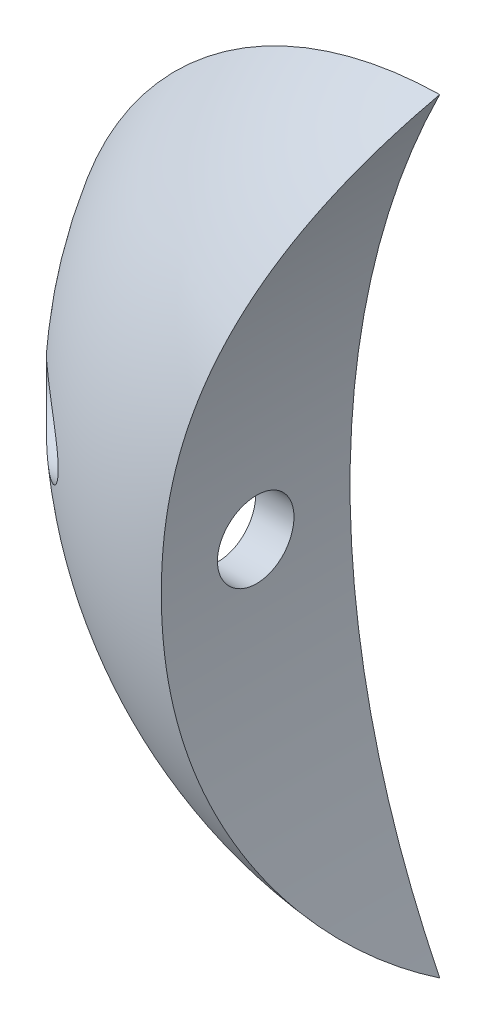
ISO-10303-21;
HEADER;
FILE_DESCRIPTION(('STEP AP214'),'2;1');
FILE_NAME('part.step','',(''),(''),'','','');
FILE_SCHEMA(('AUTOMOTIVE_DESIGN { 1 0 10303 214 1 1 1 1 }'));
ENDSEC;
DATA;
#1=APPLICATION_CONTEXT('core data for automotive mechanical design processes');
#2=APPLICATION_PROTOCOL_DEFINITION('international standard','automotive_design',2000,#1);
#3=PRODUCT_CONTEXT('',#1,'mechanical');
#4=PRODUCT('Part','Part','',(#3));
#5=PRODUCT_RELATED_PRODUCT_CATEGORY('part','',(#4));
#6=PRODUCT_DEFINITION_FORMATION('','',#4);
#7=PRODUCT_DEFINITION_CONTEXT('part definition',#1,'design');
#8=PRODUCT_DEFINITION('design','',#6,#7);
#9=PRODUCT_DEFINITION_SHAPE('','',#8);
#10=(LENGTH_UNIT() NAMED_UNIT(*) SI_UNIT(.MILLI.,.METRE.));
#11=(NAMED_UNIT(*) PLANE_ANGLE_UNIT() SI_UNIT($,.RADIAN.));
#12=(NAMED_UNIT(*) SI_UNIT($,.STERADIAN.) SOLID_ANGLE_UNIT());
#13=UNCERTAINTY_MEASURE_WITH_UNIT(LENGTH_MEASURE(1.E-05),#10,'distance_accuracy_value','');
#14=(GEOMETRIC_REPRESENTATION_CONTEXT(3) GLOBAL_UNCERTAINTY_ASSIGNED_CONTEXT((#13)) GLOBAL_UNIT_ASSIGNED_CONTEXT((#10,
#11,#12)) REPRESENTATION_CONTEXT('',''));
#15=CARTESIAN_POINT('',(0.,0.,0.));
#16=DIRECTION('',(0.,0.,1.));
#17=DIRECTION('',(1.,0.,0.));
#18=AXIS2_PLACEMENT_3D('',#15,#16,#17);
#19=CARTESIAN_POINT('',(20.,-2.8421709430404E-13,5.));
#20=DIRECTION('',(0.,0.,-1.));
#21=DIRECTION('',(-1.,0.,0.));
#22=AXIS2_PLACEMENT_3D('',#19,#20,#21);
#23=CYLINDRICAL_SURFACE('',#22,22.5);
#24=CARTESIAN_POINT('',(-2.5,0.,1.46623123312529));
#25=CARTESIAN_POINT('',(-2.49999970200126,-0.0561407001500908,1.46623371342012));
#26=CARTESIAN_POINT('',(-2.49978762986184,-0.112321401379746,1.47097477575549));
#27=CARTESIAN_POINT('',(-2.4989620196337,-0.223133518833943,1.489820880681));
#28=CARTESIAN_POINT('',(-2.49834800639444,-0.277763021477216,1.50393700619354));
#29=CARTESIAN_POINT('',(-2.496788022875,-0.383851449231198,1.54112876239483));
#30=CARTESIAN_POINT('',(-2.4958422195722,-0.435311953893261,1.56419988699213));
#31=CARTESIAN_POINT('',(-2.49372523005697,-0.533615645913031,1.61863996101896));
#32=CARTESIAN_POINT('',(-2.49255409766115,-0.580459931756681,1.65000692977394));
#33=CARTESIAN_POINT('',(-2.49011715050535,-0.668254361190132,1.72017751513281));
#34=CARTESIAN_POINT('',(-2.48885126813371,-0.709200233670585,1.75898647363515));
#35=CARTESIAN_POINT('',(-2.48636807973794,-0.783999222195647,1.84292896788812));
#36=CARTESIAN_POINT('',(-2.48515077568323,-0.817852050916981,1.88806275972));
#37=CARTESIAN_POINT('',(-2.48290156216832,-0.877514854244571,1.98339496698191));
#38=CARTESIAN_POINT('',(-2.48186972644339,-0.903321633024065,2.03359538438248));
#39=CARTESIAN_POINT('',(-2.48010859429159,-0.946139231500847,2.13762171367778));
#40=CARTESIAN_POINT('',(-2.47937929592463,-0.963150107603685,2.19144760232091));
#41=CARTESIAN_POINT('',(-2.47830606766049,-0.987882118361988,2.30115891631267));
#42=CARTESIAN_POINT('',(-2.47796188106446,-0.995609441286061,2.3570429441006));
#43=CARTESIAN_POINT('',(-2.47769691710144,-1.00157408259749,2.46931593159571));
#44=CARTESIAN_POINT('',(-2.47777613693493,-0.999811463731322,2.52570488796189));
#45=CARTESIAN_POINT('',(-2.47834881364447,-0.986851423933263,2.6373450287686));
#46=CARTESIAN_POINT('',(-2.47884197705066,-0.97566068714837,2.69259699086967));
#47=CARTESIAN_POINT('',(-2.48018649120723,-0.944172429252886,2.80043733087246));
#48=CARTESIAN_POINT('',(-2.48103784323402,-0.923874875689811,2.85302569928162));
#49=CARTESIAN_POINT('',(-2.48300311283927,-0.874741508778995,2.95406760448545));
#50=CARTESIAN_POINT('',(-2.48411712427134,-0.845902642498839,3.00251965483986));
#51=CARTESIAN_POINT('',(-2.48648204909733,-0.780507512187128,3.0938972816263));
#52=CARTESIAN_POINT('',(-2.48773296324329,-0.743951205760373,3.1368228276968));
#53=CARTESIAN_POINT('',(-2.49023200011688,-0.664121146537158,3.21596785872733));
#54=CARTESIAN_POINT('',(-2.49148011948889,-0.62084160371057,3.25218150390637));
#55=CARTESIAN_POINT('',(-2.49383183917196,-0.528813989725175,3.31682977508459));
#56=CARTESIAN_POINT('',(-2.49493543945202,-0.480065917393266,3.34526439941503));
#57=CARTESIAN_POINT('',(-2.49687377132322,-0.378481659078785,3.39354688667477));
#58=CARTESIAN_POINT('',(-2.49770849673829,-0.325645379224527,3.41339455236495));
#59=CARTESIAN_POINT('',(-2.49901490497213,-0.217386029032361,3.44393593264616));
#60=CARTESIAN_POINT('',(-2.49948658994129,-0.161962974018597,3.45462970145792));
#61=CARTESIAN_POINT('',(-2.50001347811559,-0.0501540421328536,3.46655254740309));
#62=CARTESIAN_POINT('',(-2.50006903680915,0.00623097166894591,3.46778970315174));
#63=CARTESIAN_POINT('',(-2.49975835363785,0.118407826438631,3.4607852774643));
#64=CARTESIAN_POINT('',(-2.49939211287036,0.174199668949357,3.45254372068845));
#65=CARTESIAN_POINT('',(-2.49827931845409,0.283583858106866,3.42682250354114));
#66=CARTESIAN_POINT('',(-2.4975329163893,0.337177072229535,3.40934652516203));
#67=CARTESIAN_POINT('',(-2.49574385788527,0.440669387084188,3.36565627598857));
#68=CARTESIAN_POINT('',(-2.49470120010262,0.49056847106335,3.33944196556901));
#69=CARTESIAN_POINT('',(-2.49243609122903,0.585293200614388,3.27899845571721));
#70=CARTESIAN_POINT('',(-2.49121351870383,0.630115383062398,3.24476383362774));
#71=CARTESIAN_POINT('',(-2.48872670358069,0.713379165435896,3.16925943061788));
#72=CARTESIAN_POINT('',(-2.48746246076841,0.751820732534277,3.12798961350491));
#73=CARTESIAN_POINT('',(-2.48503379564252,0.821259199602127,3.039551606757));
#74=CARTESIAN_POINT('',(-2.48386944371127,0.852250877696047,2.99237931489225));
#75=CARTESIAN_POINT('',(-2.4817729560006,0.90587414200463,2.89349618625071));
#76=CARTESIAN_POINT('',(-2.4808408193695,0.928505758880875,2.84178536612041));
#77=CARTESIAN_POINT('',(-2.47931437174509,0.964757347288472,2.73531250969526));
#78=CARTESIAN_POINT('',(-2.47871993536801,0.978380663794425,2.6805516141573));
#79=CARTESIAN_POINT('',(-2.47793556416301,0.996239882420215,2.56951705239061));
#80=CARTESIAN_POINT('',(-2.4777456276766,1.00047582302932,2.51324339236532));
#81=CARTESIAN_POINT('',(-2.47779171818862,0.999439661359756,2.40083273056477));
#82=CARTESIAN_POINT('',(-2.47802737699578,0.994175777577939,2.34469565269704));
#83=CARTESIAN_POINT('',(-2.47889731869429,0.974306356015566,2.23410300465704));
#84=CARTESIAN_POINT('',(-2.47953160235679,0.959700800163337,2.17964743773791));
#85=CARTESIAN_POINT('',(-2.48112722235125,0.921564212572995,2.07396161881699));
#86=CARTESIAN_POINT('',(-2.48208856236191,0.898033080440564,2.0227314031013));
#87=CARTESIAN_POINT('',(-2.48422990329677,0.842714934197416,1.92494867625429));
#88=CARTESIAN_POINT('',(-2.48540989711962,0.810928188195256,1.87839601328327));
#89=CARTESIAN_POINT('',(-2.4878566863846,0.739972454791415,1.79124928582556));
#90=CARTESIAN_POINT('',(-2.48912354684377,0.700797898592305,1.75065975757007));
#91=CARTESIAN_POINT('',(-2.4916008946134,0.616179215813134,1.67662123122479));
#92=CARTESIAN_POINT('',(-2.4928113679493,0.570733545988788,1.64317399594308));
#93=CARTESIAN_POINT('',(-2.49504022309919,0.474832913352243,1.58435715679727));
#94=CARTESIAN_POINT('',(-2.49605843966493,0.424373697638133,1.55899448900162));
#95=CARTESIAN_POINT('',(-2.49778543851587,0.319946860539252,1.51713101450768));
#96=CARTESIAN_POINT('',(-2.49849458725298,0.26598348167688,1.50061970765746));
#97=CARTESIAN_POINT('',(-2.49933533077149,0.176402470004882,1.4812732916598));
#98=CARTESIAN_POINT('',(-2.49958349090674,0.141365483681337,1.47563968703867));
#99=CARTESIAN_POINT('',(-2.49991591956123,0.0708909822856965,1.46811787585014));
#100=CARTESIAN_POINT('',(-2.50000018818947,0.0354534674799835,1.46622966679193));
#101=CARTESIAN_POINT('',(-2.5,0.,1.46623123312529));
#102=B_SPLINE_CURVE_WITH_KNOTS('',3,(#24,#25,#26,#27,#28,#29,#30,#31,#32,#33,#34,#35,#36,#37,
#38,#39,#40,#41,#42,#43,#44,#45,#46,#47,#48,#49,#50,#51,#52,#53,#54,#55,#56,#57,#58,#59,#60,#61,
#62,#63,#64,#65,#66,#67,#68,#69,#70,#71,#72,#73,#74,#75,#76,#77,#78,#79,#80,#81,#82,#83,#84,#85,
#86,#87,#88,#89,#90,#91,#92,#93,#94,#95,#96,#97,#98,#99,#100,#101),.UNSPECIFIED.,.T.,.F.,(4,2,2,
2,2,2,2,2,2,2,2,2,2,2,2,2,2,2,2,2,2,2,2,2,2,2,2,2,2,2,2,2,2,2,2,2,2,2,4),(0.,0.168292684923745,
0.33678467545992,0.505191991717104,0.673559136120796,0.84204759080406,1.0105428692573,
1.17910498768037,1.34766602515047,1.51611464006603,1.68456214121874,1.85289032043237,
2.02121909949454,2.18960811728897,2.35799806014041,2.52653383215419,2.69506964032214,
2.86360931948687,3.03214800034353,3.20054268551404,3.36893693258248,3.53726408730739,
3.70559200534653,3.87403406264102,4.04247698651241,4.21103763560333,4.37959766647064,
4.54809507219311,4.71659178705656,4.88494280175723,5.05329414213768,5.22164737617953,
5.38999514348073,5.55847031919273,5.72698702876663,5.89564792873424,6.0641083051714,
6.17038705096734,6.27666572608382),.UNSPECIFIED.);
#103=CARTESIAN_POINT('',(-2.5,0.,1.46623123312529));
#104=VERTEX_POINT('',#103);
#105=EDGE_CURVE('E89',#104,#104,#102,.T.);
#106=ORIENTED_EDGE('',*,*,#105,.T.);
#107=EDGE_LOOP('',(#106));
#108=FACE_BOUND('',#107,.T.);
#109=CARTESIAN_POINT('',(20.,-2.8421709430404E-13,0.));
#110=DIRECTION('',(0.,0.,-1.));
#111=DIRECTION('',(1.,0.,0.));
#112=AXIS2_PLACEMENT_3D('',#109,#110,#111);
#113=CIRCLE('',#112,22.5);
#114=CARTESIAN_POINT('',(-0.156250000000008,-9.9987792223601,0.));
#115=VERTEX_POINT('',#114);
#116=CARTESIAN_POINT('',(-0.156250000000001,9.9987792223601,0.));
#117=VERTEX_POINT('',#116);
#118=EDGE_CURVE('E79',#115,#117,#113,.T.);
#119=ORIENTED_EDGE('',*,*,#118,.T.);
#120=CARTESIAN_POINT('',(-0.156250000000001,9.9987792223601,0.));
#121=CARTESIAN_POINT('',(-0.22488818685206,9.86042013493217,0.237820306172364));
#122=CARTESIAN_POINT('',(-0.296710434977509,9.71205345592186,0.468844207294482));
#123=CARTESIAN_POINT('',(-0.444733711333898,9.39644541235819,0.91601634626368));
#124=CARTESIAN_POINT('',(-0.520933355108069,9.22920999953943,1.1321692404103));
#125=CARTESIAN_POINT('',(-0.675647419316896,8.87719032166086,1.54814416210104));
#126=CARTESIAN_POINT('',(-0.754158058286333,8.69243373340603,1.7479910475793));
#127=CARTESIAN_POINT('',(-0.911678702914412,8.30633231004821,2.13076079524123));
#128=CARTESIAN_POINT('',(-0.990688734743916,8.10498659881888,2.3136827624796));
#129=CARTESIAN_POINT('',(-1.14680578977101,7.68841574514166,2.66056541770348));
#130=CARTESIAN_POINT('',(-1.22392211562612,7.47329460705383,2.82464689521711));
#131=CARTESIAN_POINT('',(-1.37507895347633,7.02929508994273,3.13460449507815));
#132=CARTESIAN_POINT('',(-1.44911942406999,6.80041652584397,3.28048037242855));
#133=CARTESIAN_POINT('',(-1.59251890285186,6.33036296874192,3.5534807936329));
#134=CARTESIAN_POINT('',(-1.66187817519787,6.08918867093149,3.68060639603667));
#135=CARTESIAN_POINT('',(-1.79447203294247,5.59608524918195,3.91574160103665));
#136=CARTESIAN_POINT('',(-1.85770662340616,5.34415613413729,4.02375121944178));
#137=CARTESIAN_POINT('',(-1.97891148730342,4.82201326574894,4.22400656278243));
#138=CARTESIAN_POINT('',(-2.03661264309623,4.55146781497562,4.31555044416054));
#139=CARTESIAN_POINT('',(-2.14289882431211,4.00252344650305,4.47809769555661));
#140=CARTESIAN_POINT('',(-2.19148318188319,3.72412395517238,4.54909956097337));
#141=CARTESIAN_POINT('',(-2.278553661188,3.1617908891977,4.67115610444328));
#142=CARTESIAN_POINT('',(-2.31705051995639,2.87786354712473,4.72223202003091));
#143=CARTESIAN_POINT('',(-2.38334764741286,2.30618927862102,4.8060261823669));
#144=CARTESIAN_POINT('',(-2.41115150741205,2.01844366822734,4.83875059427832));
#145=CARTESIAN_POINT('',(-2.43867071078779,1.66154718115834,4.8695152925277));
#146=CARTESIAN_POINT('',(-2.44361644320371,1.59334951085573,4.87495289155556));
#147=CARTESIAN_POINT('',(-2.45288829263678,1.45687384274735,4.88500337378948));
#148=CARTESIAN_POINT('',(-2.45721462489511,1.38859588119895,4.88961654362321));
#149=CARTESIAN_POINT('',(-2.47499485301387,1.08610341570855,4.90832000946634));
#150=CARTESIAN_POINT('',(-2.48511230249547,0.851417562911894,4.91823219472522));
#151=CARTESIAN_POINT('',(-2.49799142095668,0.38161910234102,4.93065643691951));
#152=CARTESIAN_POINT('',(-2.50075122643893,0.146506401542941,4.93316661913965));
#153=CARTESIAN_POINT('',(-2.49889851147657,-0.324055282021864,4.93143086947377));
#154=CARTESIAN_POINT('',(-2.49427388366008,-0.559504183381558,4.92717384225495));
#155=CARTESIAN_POINT('',(-2.47764819168473,-1.0299060368027,4.91084200758391));
#156=CARTESIAN_POINT('',(-2.46564678934298,-1.2648589656311,4.89876684171344));
#157=CARTESIAN_POINT('',(-2.4390733093022,-1.66279139255274,4.87006869413307));
#158=CARTESIAN_POINT('',(-2.42637246191684,-1.82607600847513,4.85592083060733));
#159=CARTESIAN_POINT('',(-2.39746600930214,-2.15180090087886,4.82234357077468));
#160=CARTESIAN_POINT('',(-2.38126032382411,-2.31424115794009,4.80291405353354));
#161=CARTESIAN_POINT('',(-2.3454176241436,-2.63795832891353,4.75830774709822));
#162=CARTESIAN_POINT('',(-2.32578059698617,-2.79923523843117,4.73313093620515));
#163=CARTESIAN_POINT('',(-2.28317954831665,-3.12028119099879,4.6766956687547));
#164=CARTESIAN_POINT('',(-2.26021527937527,-3.28005012096634,4.64543675984462));
#165=CARTESIAN_POINT('',(-2.18657966723345,-3.7561387838757,4.54224996303757));
#166=CARTESIAN_POINT('',(-2.13110906581282,-4.06974579039348,4.46084435001204));
#167=CARTESIAN_POINT('',(-2.00873049685823,-4.68665549023331,4.27182796038376));
#168=CARTESIAN_POINT('',(-1.9418220468302,-4.98995774821268,4.16421607821473));
#169=CARTESIAN_POINT('',(-1.79997675495117,-5.57673930305317,3.92546436936452));
#170=CARTESIAN_POINT('',(-1.72525898238805,-5.8605135613396,3.79492010308746));
#171=CARTESIAN_POINT('',(-1.56856547196032,-6.41322931189211,3.50907973843059));
#172=CARTESIAN_POINT('',(-1.48658941153753,-6.68217014409819,3.35378253978527));
#173=CARTESIAN_POINT('',(-1.31756913727594,-7.20321825653394,3.01896352119617));
#174=CARTESIAN_POINT('',(-1.23052012149491,-7.45530908607155,2.83941852995714));
#175=CARTESIAN_POINT('',(-1.05394357441251,-7.94027891701035,2.45716511246874));
#176=CARTESIAN_POINT('',(-0.964416665638942,-8.17316268637784,2.2544624648651));
#177=CARTESIAN_POINT('',(-0.812243562403975,-8.55154124368626,1.89081005289769));
#178=CARTESIAN_POINT('',(-0.749537379695614,-8.70239671064095,1.73541908462583));
#179=CARTESIAN_POINT('',(-0.625195868501275,-8.99312387069823,1.41428557413506));
#180=CARTESIAN_POINT('',(-0.563560428083577,-9.13299671733258,1.24854412234484));
#181=CARTESIAN_POINT('',(-0.442482604122434,-9.40087591951013,0.907635689782468));
#182=CARTESIAN_POINT('',(-0.383035529992888,-9.52890866710048,0.73249111844978));
#183=CARTESIAN_POINT('',(-0.267140872347493,-9.77298653708408,0.372987107255483));
#184=CARTESIAN_POINT('',(-0.210694497609654,-9.88902684604402,0.188624011047363));
#185=CARTESIAN_POINT('',(-0.156250000000135,-9.99877922236012,0.));
#186=B_SPLINE_CURVE_WITH_KNOTS('',3,(#120,#121,#122,#123,#124,#125,#126,#127,#128,#129,#130,
#131,#132,#133,#134,#135,#136,#137,#138,#139,#140,#141,#142,#143,#144,#145,#146,#147,#148,#149,
#150,#151,#152,#153,#154,#155,#156,#157,#158,#159,#160,#161,#162,#163,#164,#165,#166,#167,#168,
#169,#170,#171,#172,#173,#174,#175,#176,#177,#178,#179,#180,#181,#182,#183,#184,#185),
.UNSPECIFIED.,.F.,.F.,(4,2,2,2,2,2,2,2,2,2,2,2,2,2,2,2,2,2,2,2,2,2,2,2,2,2,2,2,2,2,2,2,4),(0.,
0.850376658501741,1.70048583001216,2.54927383640215,3.39810669885753,4.24115146230971,
5.08420756958887,5.92721606376634,6.77022386077244,7.64337784795733,8.51659577317758,
9.38888044329131,10.2608718947184,10.4666475950116,10.672351613901,11.3773949606545,
12.0826168593547,12.7889962138009,13.495407954112,13.9884610156125,14.4815253675175,
14.9745915810162,15.46769448007,16.4523665573242,17.4370801822286,18.3992321788894,
19.3614269550488,20.324547802079,21.2874288395378,21.9633670726336,22.6392342150314,
23.3135565541729,23.9881485050104),.UNSPECIFIED.);
#187=EDGE_CURVE('E11',#117,#115,#186,.T.);
#188=ORIENTED_EDGE('',*,*,#187,.T.);
#189=EDGE_LOOP('',(#119,#188));
#190=FACE_BOUND('',#189,.T.);
#191=ADVANCED_FACE('F41',(#108,#190),#23,.F.);
#192=CARTESIAN_POINT('',(10.,-1.4210854715202E-13,0.));
#193=DIRECTION('',(0.,0.,1.));
#194=DIRECTION('',(1.,0.,0.));
#195=AXIS2_PLACEMENT_3D('',#192,#193,#194);
#196=PLANE('',#195);
#197=CARTESIAN_POINT('',(0.,0.,0.));
#198=DIRECTION('',(0.,0.,-1.));
#199=DIRECTION('',(-1.,0.,0.));
#200=AXIS2_PLACEMENT_3D('',#197,#198,#199);
#201=CIRCLE('',#200,8.8230607357035);
#202=CARTESIAN_POINT('',(-1.86008998135206,8.6247588955974,0.));
#203=VERTEX_POINT('',#202);
#204=CARTESIAN_POINT('',(-1.86008998135231,-8.62475889559735,0.));
#205=VERTEX_POINT('',#204);
#206=EDGE_CURVE('E80',#203,#205,#201,.F.);
#207=ORIENTED_EDGE('',*,*,#206,.T.);
#208=CARTESIAN_POINT('',(20.,-2.8421709430404E-13,0.));
#209=DIRECTION('',(0.,0.,1.));
#210=DIRECTION('',(1.,0.,0.));
#211=AXIS2_PLACEMENT_3D('',#208,#209,#210);
#212=CIRCLE('',#211,23.5);
#213=EDGE_CURVE('E63',#205,#203,#212,.F.);
#214=ORIENTED_EDGE('',*,*,#213,.T.);
#215=EDGE_LOOP('',(#207,#214));
#216=FACE_BOUND('',#215,.T.);
#217=ORIENTED_EDGE('',*,*,#118,.F.);
#218=CARTESIAN_POINT('',(0.,0.,0.));
#219=DIRECTION('',(0.,0.,1.));
#220=DIRECTION('',(1.,0.,0.));
#221=AXIS2_PLACEMENT_3D('',#218,#219,#220);
#222=CIRCLE('',#221,10.);
#223=EDGE_CURVE('E57',#117,#115,#222,.T.);
#224=ORIENTED_EDGE('',*,*,#223,.F.);
#225=EDGE_LOOP('',(#217,#224));
#226=FACE_BOUND('',#225,.T.);
#227=ADVANCED_FACE('F86',(#216,#226),#196,.F.);
#228=CARTESIAN_POINT('',(0.,0.,-5.));
#229=DIRECTION('',(0.,0.,-1.));
#230=DIRECTION('',(-1.,0.,0.));
#231=AXIS2_PLACEMENT_3D('',#228,#229,#230);
#232=DEGENERATE_TOROIDAL_SURFACE('',#231,1.33974596215562,10.,.T.);
#233=CARTESIAN_POINT('',(-8.78986478303913,-0.576788953284713,1.64933768191987));
#234=CARTESIAN_POINT('',(-8.74770259499907,-0.637398975209099,1.69213552837994));
#235=CARTESIAN_POINT('',(-8.70011875938652,-0.6908714170108,1.74001954406786));
#236=CARTESIAN_POINT('',(-8.59785568725852,-0.784014214644302,1.84162352882858));
#237=CARTESIAN_POINT('',(-8.54312883625406,-0.823584705592019,1.89538222683344));
#238=CARTESIAN_POINT('',(-8.41855560740786,-0.896186674572858,2.01603864184436));
#239=CARTESIAN_POINT('',(-8.3477887178019,-0.92663946583979,2.08352249001654));
#240=CARTESIAN_POINT('',(-8.20267369665099,-0.971701296706125,2.21941448504407));
#241=CARTESIAN_POINT('',(-8.12833137349287,-0.986335183146414,2.28782101100253));
#242=CARTESIAN_POINT('',(-7.97511381213195,-1.0016934824594,2.42613057480783));
#243=CARTESIAN_POINT('',(-7.89617000440128,-1.00194070898113,2.49600804736971));
#244=CARTESIAN_POINT('',(-7.73733954081223,-0.988307601142956,2.63371494509599));
#245=CARTESIAN_POINT('',(-7.65745092253728,-0.974389332689889,2.70153836752332));
#246=CARTESIAN_POINT('',(-7.52928295667334,-0.94072037492889,2.80805410367275));
#247=CARTESIAN_POINT('',(-7.48074412364665,-0.92531600527723,2.84785576709451));
#248=CARTESIAN_POINT('',(-7.38432280932521,-0.88914219487863,2.92588040127431));
#249=CARTESIAN_POINT('',(-7.33644073093218,-0.868369603410112,2.96410242957859));
#250=CARTESIAN_POINT('',(-7.24211160839214,-0.821303877244849,3.03840842630375));
#251=CARTESIAN_POINT('',(-7.19565926092595,-0.795034965377417,3.07450091352002));
#252=CARTESIAN_POINT('',(-7.1047763664425,-0.736495476538488,3.14420200830205));
#253=CARTESIAN_POINT('',(-7.06034311527005,-0.704233240021481,3.17781397807839));
#254=CARTESIAN_POINT('',(-6.98251238140407,-0.639561349842123,3.23596347267796));
#255=CARTESIAN_POINT('',(-6.94858864869565,-0.608271089480893,3.26103272899888));
#256=CARTESIAN_POINT('',(-6.88379105097295,-0.540691454381654,3.30846519090229));
#257=CARTESIAN_POINT('',(-6.85292042779339,-0.504396861794838,3.33082552566062));
#258=CARTESIAN_POINT('',(-6.79536824467894,-0.425778294845585,3.37216644566556));
#259=CARTESIAN_POINT('',(-6.76875702621865,-0.383371506301003,3.39109086046032));
#260=CARTESIAN_POINT('',(-6.72281712094082,-0.292935344733375,3.4235536571127));
#261=CARTESIAN_POINT('',(-6.70345632307561,-0.244932028545143,3.43711580294663));
#262=CARTESIAN_POINT('',(-6.6802832792799,-0.16348180093685,3.45329537991361));
#263=CARTESIAN_POINT('',(-6.67336176970447,-0.131351700833596,3.45811078273687));
#264=CARTESIAN_POINT('',(-6.66405824056973,-0.066127657723367,3.46457828109597));
#265=CARTESIAN_POINT('',(-6.66167249905956,-0.0330345276199341,3.46623297024872));
#266=CARTESIAN_POINT('',(-6.66167751330111,0.0331917030136322,3.46622949047491));
#267=CARTESIAN_POINT('',(-6.66407423049717,0.0663248019139322,3.46456718684086));
#268=CARTESIAN_POINT('',(-6.67341308885332,0.131625540892701,3.45807508686816));
#269=CARTESIAN_POINT('',(-6.68035868721167,0.163792427176611,3.45324288136571));
#270=CARTESIAN_POINT('',(-6.70039810004752,0.234125568372992,3.43925088644659));
#271=CARTESIAN_POINT('',(-6.71458328275988,0.271823833907131,3.42931948918023));
#272=CARTESIAN_POINT('',(-6.74768748735668,0.343917169174853,3.40599952529501));
#273=CARTESIAN_POINT('',(-6.76661547472211,0.378305810252135,3.39260440954358));
#274=CARTESIAN_POINT('',(-6.81811473884895,0.459742803420802,3.35589437892647));
#275=CARTESIAN_POINT('',(-6.85281549128559,0.504690219616088,3.33094220886652));
#276=CARTESIAN_POINT('',(-6.92701493460925,0.587572274724659,3.27691951582438));
#277=CARTESIAN_POINT('',(-6.96652454426664,0.62549044204937,3.24783959472708));
#278=CARTESIAN_POINT('',(-7.04062481836644,0.688329459860361,3.19258816721996));
#279=CARTESIAN_POINT('',(-7.07469199546833,0.714346195796301,3.16693946065706));
#280=CARTESIAN_POINT('',(-7.14421646949522,0.762642728951246,3.11404208838266));
#281=CARTESIAN_POINT('',(-7.17967455838316,0.784920357932322,3.08679250663219));
#282=CARTESIAN_POINT('',(-7.28757144802367,0.846595046508055,3.00298332673692));
#283=CARTESIAN_POINT('',(-7.36147478011775,0.880786961010515,2.944406416118));
#284=CARTESIAN_POINT('',(-7.4844388164185,0.926553571184938,2.84484025613203));
#285=CARTESIAN_POINT('',(-7.53306873715379,0.941852011214029,2.80493412932808));
#286=CARTESIAN_POINT('',(-7.63061332177804,0.96719059982891,2.72381376317187));
#287=CARTESIAN_POINT('',(-7.67952802941464,0.977229917765335,2.68259931826759));
#288=CARTESIAN_POINT('',(-7.82612719962237,0.999432005263352,2.55744445733808));
#289=CARTESIAN_POINT('',(-7.9237915429142,1.00372464705735,2.47189150071544));
#290=CARTESIAN_POINT('',(-8.09664721365384,0.991172419152783,2.31672668931939));
#291=CARTESIAN_POINT('',(-8.17239898917323,0.978415306419493,2.24737905888734));
#292=CARTESIAN_POINT('',(-8.32027915872551,0.936983394815694,2.10954205450122));
#293=CARTESIAN_POINT('',(-8.39241397384881,0.908337977961652,2.04105133423982));
#294=CARTESIAN_POINT('',(-8.50963337714655,0.844459642806785,1.92796056552522));
#295=CARTESIAN_POINT('',(-8.55630292318058,0.813836278041282,1.88239769135054));
#296=CARTESIAN_POINT('',(-8.64535334676662,0.743007225474959,1.79458147190919));
#297=CARTESIAN_POINT('',(-8.68773982907861,0.702814297779785,1.75232381828599));
#298=CARTESIAN_POINT('',(-8.75696250490914,0.623064604699992,1.68272389751582));
#299=CARTESIAN_POINT('',(-8.78509527200544,0.585646865462438,1.65422929165438));
#300=CARTESIAN_POINT('',(-8.83667133407159,0.504884146802852,1.60170636856563));
#301=CARTESIAN_POINT('',(-8.86012074049588,0.461547017849667,1.57767223367764));
#302=CARTESIAN_POINT('',(-8.89728021334027,0.377834653637546,1.53943260555517));
#303=CARTESIAN_POINT('',(-8.91198639262044,0.338358968748795,1.52423414515963));
#304=CARTESIAN_POINT('',(-8.93661922502354,0.256430420866052,1.49871906827879));
#305=CARTESIAN_POINT('',(-8.94654858941663,0.213979262434273,1.48839968253909));
#306=CARTESIAN_POINT('',(-8.96102960087159,0.126945153436493,1.47333434446307));
#307=CARTESIAN_POINT('',(-8.96555222931929,0.0823520239706563,1.46861846765936));
#308=CARTESIAN_POINT('',(-8.96877991731764,-0.0072679081771573,1.46525390132732));
#309=CARTESIAN_POINT('',(-8.96748691721725,-0.0522945612141558,1.46660318819405));
#310=CARTESIAN_POINT('',(-8.95956051061507,-0.137285686385127,1.47486100198464));
#311=CARTESIAN_POINT('',(-8.95340782388238,-0.177346557132712,1.48126908504027));
#312=CARTESIAN_POINT('',(-8.93672595054457,-0.255534905035203,1.49860186208582));
#313=CARTESIAN_POINT('',(-8.92619459908405,-0.293661415346379,1.50952879022341));
#314=CARTESIAN_POINT('',(-8.90065484340853,-0.369109654078636,1.53594170095908));
#315=CARTESIAN_POINT('',(-8.88544430425636,-0.406289513567712,1.55163298630885));
#316=CARTESIAN_POINT('',(-8.85147728560734,-0.477151827076501,1.58652421075142));
#317=CARTESIAN_POINT('',(-8.83272430161831,-0.510837678475386,1.6057206904753));
#318=CARTESIAN_POINT('',(-8.80516761960629,-0.554286878914608,1.63379006131553));
#319=CARTESIAN_POINT('',(-8.79760762437696,-0.565658274231776,1.64147810559934));
#320=CARTESIAN_POINT('',(-8.78986478303913,-0.576788953284713,1.64933768191987));
#321=B_SPLINE_CURVE_WITH_KNOTS('',3,(#233,#234,#235,#236,#237,#238,#239,#240,#241,#242,#243,
#244,#245,#246,#247,#248,#249,#250,#251,#252,#253,#254,#255,#256,#257,#258,#259,#260,#261,#262,
#263,#264,#265,#266,#267,#268,#269,#270,#271,#272,#273,#274,#275,#276,#277,#278,#279,#280,#281,
#282,#283,#284,#285,#286,#287,#288,#289,#290,#291,#292,#293,#294,#295,#296,#297,#298,#299,#300,
#301,#302,#303,#304,#305,#306,#307,#308,#309,#310,#311,#312,#313,#314,#315,#316,#317,#318,#319,
#320),.UNSPECIFIED.,.T.,.F.,(4,2,2,2,2,2,2,2,2,2,2,2,2,2,2,2,2,2,2,2,2,2,2,2,2,2,2,2,2,2,2,2,2,
2,2,2,2,2,2,2,2,2,2,4),(0.,0.255969541080933,0.51374195220327,0.819380562022019,
1.12453840289488,1.43981234504087,1.75593279347907,1.9496261698038,2.14343348803232,
2.3364040205167,2.52910799538117,2.68635446665641,2.84376615115269,3.0035562214698,
3.16262999210891,3.26186616942589,3.36102088052675,3.46029926745745,3.55965319471766,
3.68342008268913,3.80742272002326,3.99246545008695,4.17793645479122,4.32759091442051,
4.47733185826065,4.77706961963169,4.97109641835048,5.16515385330062,5.55277368051087,
5.86223140219566,6.17111874698201,6.38662451028179,6.60184451068764,6.76568247325556,
6.9293052215347,7.06310887072055,7.19683648448904,7.33127865392447,7.46567597087871,
7.58822819688763,7.7108410861234,7.83975042104007,7.96853321289973,8.01554053476894),.UNSPECIFIED.);
#322=CARTESIAN_POINT('',(-8.78986478303913,-0.576788953284713,1.64933768191987));
#323=VERTEX_POINT('',#322);
#324=EDGE_CURVE('E93',#323,#323,#321,.T.);
#325=ORIENTED_EDGE('',*,*,#324,.F.);
#326=EDGE_LOOP('',(#325));
#327=FACE_BOUND('',#326,.T.);
#328=ORIENTED_EDGE('',*,*,#187,.F.);
#329=ORIENTED_EDGE('',*,*,#223,.T.);
#330=EDGE_LOOP('',(#328,#329));
#331=FACE_BOUND('',#330,.T.);
#332=ADVANCED_FACE('F43',(#327,#331),#232,.T.);
#333=CARTESIAN_POINT('',(20.,-2.8421709430404E-13,5.));
#334=DIRECTION('',(0.,0.,-1.));
#335=DIRECTION('',(-1.,0.,0.));
#336=AXIS2_PLACEMENT_3D('',#333,#334,#335);
#337=CYLINDRICAL_SURFACE('',#336,23.5);
#338=CARTESIAN_POINT('',(-3.5,0.,1.46623123312529));
#339=CARTESIAN_POINT('',(-3.49999971447596,-0.0561431755185672,1.46623371434096));
#340=CARTESIAN_POINT('',(-3.49979664859263,-0.112326412761662,1.47097519310519));
#341=CARTESIAN_POINT('',(-3.49900610023869,-0.223143702097802,1.48982304856655));
#342=CARTESIAN_POINT('',(-3.49841816215265,-0.277775837904636,1.50394052494913));
#343=CARTESIAN_POINT('',(-3.49692443036003,-0.383869544965621,1.54113607998038));
#344=CARTESIAN_POINT('',(-3.49601879586986,-0.435332689229516,1.56420967080789));
#345=CARTESIAN_POINT('',(-3.49399173530188,-0.533641138467627,1.61865577865261));
#346=CARTESIAN_POINT('',(-3.49287036092917,-0.580487545847858,1.65002630786534));
#347=CARTESIAN_POINT('',(-3.4905370515311,-0.668283017673873,1.72020311531537));
#348=CARTESIAN_POINT('',(-3.489325056396,-0.709228114055315,1.7590143562309));
#349=CARTESIAN_POINT('',(-3.48694762674187,-0.784024980249986,1.8429612831937));
#350=CARTESIAN_POINT('',(-3.48578219410559,-0.817876463467067,1.88809722464863));
#351=CARTESIAN_POINT('',(-3.48362891809116,-0.877534924974853,1.9834315847106));
#352=CARTESIAN_POINT('',(-3.48264113914469,-0.903338987096248,2.03363182978426));
#353=CARTESIAN_POINT('',(-3.48095524636898,-0.946151359516975,2.13765689954098));
#354=CARTESIAN_POINT('',(-3.48025713078885,-0.963159722982041,2.19148170231313));
#355=CARTESIAN_POINT('',(-3.4792298037256,-0.987887904630292,2.301193137948));
#356=CARTESIAN_POINT('',(-3.47890036698437,-0.99561339474416,2.35707849025469));
#357=CARTESIAN_POINT('',(-3.4786468689999,-1.00157402397008,2.46935372309658));
#358=CARTESIAN_POINT('',(-3.47872280523897,-0.999809222024273,2.52574360049611));
#359=CARTESIAN_POINT('',(-3.47927128052084,-0.986844105298017,2.63738866944576));
#360=CARTESIAN_POINT('',(-3.47974356206262,-0.975649916664968,2.69264457385303));
#361=CARTESIAN_POINT('',(-3.48103108768068,-0.944153276497369,2.80049221811959));
#362=CARTESIAN_POINT('',(-3.48184633290779,-0.923850794399282,2.85308394903839));
#363=CARTESIAN_POINT('',(-3.48372819077275,-0.874706866253457,2.95413010575366));
#364=CARTESIAN_POINT('',(-3.48479488580238,-0.845862620556749,3.00258316834074));
#365=CARTESIAN_POINT('',(-3.48705932237907,-0.780455997798865,3.09396166251737));
#366=CARTESIAN_POINT('',(-3.48825706458172,-0.743893582125251,3.13688706645144));
#367=CARTESIAN_POINT('',(-3.49064973324011,-0.664053887239718,3.21602741428725));
#368=CARTESIAN_POINT('',(-3.49184465670596,-0.620771300771665,3.25223700434097));
#369=CARTESIAN_POINT('',(-3.49409608137426,-0.528738577032875,3.31687662841695));
#370=CARTESIAN_POINT('',(-3.49515258254826,-0.479988438638827,3.3453066608409));
#371=CARTESIAN_POINT('',(-3.49700811388115,-0.378401380052389,3.39357959820242));
#372=CARTESIAN_POINT('',(-3.49780713867474,-0.325564374726241,3.41342232420051));
#373=CARTESIAN_POINT('',(-3.49905757657312,-0.217304796506651,3.44395392269724));
#374=CARTESIAN_POINT('',(-3.49950899156657,-0.16188223766288,3.45464284493074));
#375=CARTESIAN_POINT('',(-3.50001308796552,-0.0500712919144485,3.46655683453382));
#376=CARTESIAN_POINT('',(-3.50006608143107,0.00631630442829819,3.46778930859612));
#377=CARTESIAN_POINT('',(-3.49976818957582,0.118497548581613,3.46077473375145));
#378=CARTESIAN_POINT('',(-3.49941730521648,0.174291197805802,3.45252770741123));
#379=CARTESIAN_POINT('',(-3.4983513899327,0.283680063712129,3.42679436446683));
#380=CARTESIAN_POINT('',(-3.49763649198339,0.337276075477068,3.40931142167952));
#381=CARTESIAN_POINT('',(-3.49592306729519,0.44077273358209,3.36560594245105));
#382=CARTESIAN_POINT('',(-3.49492453937922,0.49067336458513,3.33938336974005));
#383=CARTESIAN_POINT('',(-3.49275547334263,0.585396813061249,3.27892398083443));
#384=CARTESIAN_POINT('',(-3.49158482863951,0.630216453476586,3.24468219093178));
#385=CARTESIAN_POINT('',(-3.48920376307169,0.713473727731978,3.16916364802284));
#386=CARTESIAN_POINT('',(-3.48799334201821,0.751911331274881,3.12788686162152));
#387=CARTESIAN_POINT('',(-3.48566827442761,0.821338283027644,3.03943820927667));
#388=CARTESIAN_POINT('',(-3.48455368972768,0.852322845088952,2.99226258464548));
#389=CARTESIAN_POINT('',(-3.48254694220349,0.90593146920041,2.89337445443163));
#390=CARTESIAN_POINT('',(-3.48165477861141,0.928555560112335,2.84166196451176));
#391=CARTESIAN_POINT('',(-3.48019391287719,0.964792658298407,2.73518588659604));
#392=CARTESIAN_POINT('',(-3.47962510052556,0.978408736080376,2.68042334516099));
#393=CARTESIAN_POINT('',(-3.47887476539502,0.996253348268764,2.56938696279355));
#394=CARTESIAN_POINT('',(-3.47869324121943,1.00048191652955,2.51311312731209));
#395=CARTESIAN_POINT('',(-3.4787379898794,0.99943112577655,2.4006992675371));
#396=CARTESIAN_POINT('',(-3.47896393957712,0.99415930083475,2.34455917253337));
#397=CARTESIAN_POINT('',(-3.47979748577982,0.974272918120248,2.23396177399972));
#398=CARTESIAN_POINT('',(-3.48040508302627,0.959658342196498,2.17950447373933));
#399=CARTESIAN_POINT('',(-3.48193337069552,0.921502724278594,2.07381659193278));
#400=CARTESIAN_POINT('',(-3.48285406497099,0.897961572442109,2.02258605010121));
#401=CARTESIAN_POINT('',(-3.4849047344655,0.842622629333935,1.92480452205603));
#402=CARTESIAN_POINT('',(-3.48603470276999,0.810825110844248,1.87825338131022));
#403=CARTESIAN_POINT('',(-3.48837754969336,0.739850074792755,1.79111507800844));
#404=CARTESIAN_POINT('',(-3.48959048458404,0.700667516091256,1.75053202324534));
#405=CARTESIAN_POINT('',(-3.49196224731697,0.616034005808977,1.676507877023));
#406=CARTESIAN_POINT('',(-3.49312106173763,0.570581510251009,1.64306854989796));
#407=CARTESIAN_POINT('',(-3.49525461100671,0.474670438386316,1.58426976594453));
#408=CARTESIAN_POINT('',(-3.49622919344716,0.424207769532103,1.55891698699112));
#409=CARTESIAN_POINT('',(-3.49788201003235,0.319776250768868,1.51707361302512));
#410=CARTESIAN_POINT('',(-3.49856059547672,0.265811644987285,1.50057250715891));
#411=CARTESIAN_POINT('',(-3.49936466078891,0.176257761247698,1.4812484387153));
#412=CARTESIAN_POINT('',(-3.49960187167147,0.141249081194375,1.47562413142036));
#413=CARTESIAN_POINT('',(-3.4999196313066,0.070832250264196,1.46811474698631));
#414=CARTESIAN_POINT('',(-3.50000018015426,0.0354240996298445,1.46622966757738));
#415=CARTESIAN_POINT('',(-3.5,0.,1.46623123312529));
#416=B_SPLINE_CURVE_WITH_KNOTS('',3,(#338,#339,#340,#341,#342,#343,#344,#345,#346,#347,#348,
#349,#350,#351,#352,#353,#354,#355,#356,#357,#358,#359,#360,#361,#362,#363,#364,#365,#366,#367,
#368,#369,#370,#371,#372,#373,#374,#375,#376,#377,#378,#379,#380,#381,#382,#383,#384,#385,#386,
#387,#388,#389,#390,#391,#392,#393,#394,#395,#396,#397,#398,#399,#400,#401,#402,#403,#404,#405,
#406,#407,#408,#409,#410,#411,#412,#413,#414,#415),.UNSPECIFIED.,.T.,.F.,(4,2,2,2,2,2,2,2,2,2,2,
2,2,2,2,2,2,2,2,2,2,2,2,2,2,2,2,2,2,2,2,2,2,2,2,2,2,2,4),(0.,0.168300219119674,0.33680003484733,
0.505215525742964,0.673590703661992,0.842078574728329,1.01057325172947,1.17912891592067,
1.3476835612627,1.516135165535,1.68458572359238,1.85292692589157,2.02126869307604,
2.18966569715234,2.35806354370462,2.52659506538098,2.69512662168228,2.86366168961992,
3.03219584185947,3.20059797748879,3.36899971222346,3.53733997345423,3.70568093331314,
3.87412658002486,4.04257302636806,4.21112735754574,4.3796811068396,4.54817737257726,
4.71667303066245,4.88503512587229,5.05339754817611,5.22176204226213,5.39012097446321,
5.55859524998548,5.727111086746,5.89576572581368,6.06421965135944,6.17041042688644,
6.27660113795244),.UNSPECIFIED.);
#417=CARTESIAN_POINT('',(-3.5,0.,1.46623123312529));
#418=VERTEX_POINT('',#417);
#419=EDGE_CURVE('E131',#418,#418,#416,.T.);
#420=ORIENTED_EDGE('',*,*,#419,.F.);
#421=EDGE_LOOP('',(#420));
#422=FACE_BOUND('',#421,.T.);
#423=ORIENTED_EDGE('',*,*,#213,.F.);
#424=CARTESIAN_POINT('',(-1.86008998135206,8.6247588955974,0.));
#425=CARTESIAN_POINT('',(-1.91543458038285,8.48450793931013,0.187770297424139));
#426=CARTESIAN_POINT('',(-1.97226036819279,8.33650389049305,0.369256663121343));
#427=CARTESIAN_POINT('',(-2.08749450794791,8.02619761008802,0.718882275190787));
#428=CARTESIAN_POINT('',(-2.14590216166349,7.86390161791777,0.887027285632097));
#429=CARTESIAN_POINT('',(-2.26285286081207,7.52643552554604,1.20903095574733));
#430=CARTESIAN_POINT('',(-2.32139539721741,7.35129199150783,1.36291768538351));
#431=CARTESIAN_POINT('',(-2.43746961673033,6.98900098548576,1.65629859779252));
#432=CARTESIAN_POINT('',(-2.49500117331648,6.80185202449351,1.79579098964667));
#433=CARTESIAN_POINT('',(-2.6110057709442,6.40603430564753,2.06735364655329));
#434=CARTESIAN_POINT('',(-2.66935263692529,6.19674750768082,2.19857720189617));
#435=CARTESIAN_POINT('',(-2.78231832174071,5.76759982382411,2.44427735692967));
#436=CARTESIAN_POINT('',(-2.83693687419378,5.54773818428985,2.5587527606618));
#437=CARTESIAN_POINT('',(-2.94128987563093,5.09904328518201,2.77081393038438));
#438=CARTESIAN_POINT('',(-2.99102662279072,4.87021431878163,2.86840766030696));
#439=CARTESIAN_POINT('',(-3.08467804755837,4.40499129249355,3.04690198617551));
#440=CARTESIAN_POINT('',(-3.12859256571331,4.16859702563559,3.12780212496921));
#441=CARTESIAN_POINT('',(-3.21313500840682,3.67006868684152,3.27926617830151));
#442=CARTESIAN_POINT('',(-3.25319680133546,3.40741514555448,3.3484355127735));
#443=CARTESIAN_POINT('',(-3.32478017016587,2.87685579418063,3.46855148502331));
#444=CARTESIAN_POINT('',(-3.35630147253081,2.60894981616218,3.51949753915834));
#445=CARTESIAN_POINT('',(-3.41032175007263,2.06897203252085,3.60458435801028));
#446=CARTESIAN_POINT('',(-3.43279948872625,1.79689196115996,3.63868560920161));
#447=CARTESIAN_POINT('',(-3.46829605533644,1.25060484247075,3.69152760594398));
#448=CARTESIAN_POINT('',(-3.48131346712951,0.976397482904765,3.71026605181385));
#449=CARTESIAN_POINT('',(-3.49438069994284,0.539074008837121,3.72894376703746));
#450=CARTESIAN_POINT('',(-3.49755316069712,0.37622058456379,3.73343201852589));
#451=CARTESIAN_POINT('',(-3.50051046977394,0.0504115588756674,3.73761690830543));
#452=CARTESIAN_POINT('',(-3.5002952233522,-0.112544045269348,3.73731341258537));
#453=CARTESIAN_POINT('',(-3.49647608745208,-0.438351915595517,3.7319068409957));
#454=CARTESIAN_POINT('',(-3.49287190496199,-0.601204171622712,3.72680335011242));
#455=CARTESIAN_POINT('',(-3.48229074407815,-0.926570058511745,3.71163844145235));
#456=CARTESIAN_POINT('',(-3.4753135527824,-1.08908366734802,3.7015767107141));
#457=CARTESIAN_POINT('',(-3.44938774024515,-1.57521922025184,3.66360034387286));
#458=CARTESIAN_POINT('',(-3.42543775080331,-1.89803074312688,3.62788639702986));
#459=CARTESIAN_POINT('',(-3.36466345153209,-2.53890846105851,3.5330087097537));
#460=CARTESIAN_POINT('',(-3.32784311188742,-2.85697608797775,3.47385220001984));
#461=CARTESIAN_POINT('',(-3.24833615921676,-3.44076622372311,3.34012665640254));
#462=CARTESIAN_POINT('',(-3.20723570717237,-3.70748321265881,3.26896015237666));
#463=CARTESIAN_POINT('',(-3.11706738544674,-4.23348291143571,3.10684621321361));
#464=CARTESIAN_POINT('',(-3.06799965421708,-4.4927657503719,3.0158991218047));
#465=CARTESIAN_POINT('',(-2.96303154260386,-5.00166245775005,2.81384090032699));
#466=CARTESIAN_POINT('',(-2.90713730031117,-5.25128475036724,2.70274784165166));
#467=CARTESIAN_POINT('',(-2.78981634514314,-5.73909411167747,2.46024513852763));
#468=CARTESIAN_POINT('',(-2.72839003349626,-5.97728200776354,2.32883696699351));
#469=CARTESIAN_POINT('',(-2.60114911238471,-6.44177122541961,2.04497543524388));
#470=CARTESIAN_POINT('',(-2.53530883395542,-6.66798630221683,1.89239223122899));
#471=CARTESIAN_POINT('',(-2.4013988800396,-7.10489646926747,1.56731519674873));
#472=CARTESIAN_POINT('',(-2.3333294514225,-7.31559326976703,1.3948235657564));
#473=CARTESIAN_POINT('',(-2.19647258946926,-7.72092000502406,1.02942722165952));
#474=CARTESIAN_POINT('',(-2.12768336862972,-7.91543620165482,0.836396723468505));
#475=CARTESIAN_POINT('',(-1.99194928188669,-8.28511981427269,0.431809324738561));
#476=CARTESIAN_POINT('',(-1.92500558835216,-8.46027513461244,0.220240989038601));
#477=CARTESIAN_POINT('',(-1.86008998135231,-8.62475889559735,0.));
#478=B_SPLINE_CURVE_WITH_KNOTS('',3,(#424,#425,#426,#427,#428,#429,#430,#431,#432,#433,#434,
#435,#436,#437,#438,#439,#440,#441,#442,#443,#444,#445,#446,#447,#448,#449,#450,#451,#452,#453,
#454,#455,#456,#457,#458,#459,#460,#461,#462,#463,#464,#465,#466,#467,#468,#469,#470,#471,#472,
#473,#474,#475,#476,#477),.UNSPECIFIED.,.F.,.F.,(4,2,2,2,2,2,2,2,2,2,2,2,2,2,2,2,2,2,2,2,2,2,2,
2,2,2,4),(0.,0.722167310982744,1.44402089455261,2.16442176396831,2.88491215662187,
3.64555028817143,4.40624270917983,5.16657528890498,5.92692868749756,6.74972885754432,
7.57255537731432,8.39730297518762,9.2221740082259,9.71092090865257,10.199681477927,
10.688484309946,11.1773179988923,12.1532049980807,13.1287912255474,13.9652053601903,
14.8016049615838,15.6372579716307,16.472850422391,17.3138138457883,18.1546844487426,
19.0010386612837,19.8479186775813),.UNSPECIFIED.);
#479=EDGE_CURVE('E73',#203,#205,#478,.T.);
#480=ORIENTED_EDGE('',*,*,#479,.F.);
#481=EDGE_LOOP('',(#423,#480));
#482=FACE_BOUND('',#481,.T.);
#483=ADVANCED_FACE('F75',(#422,#482),#337,.T.);
#484=CARTESIAN_POINT('',(0.,0.,-5.));
#485=DIRECTION('',(0.,0.,-1.));
#486=DIRECTION('',(-1.,0.,0.));
#487=AXIS2_PLACEMENT_3D('',#484,#485,#486);
#488=DEGENERATE_TOROIDAL_SURFACE('',#487,1.33974596215562,9.,.T.);
#489=CARTESIAN_POINT('',(-7.30943685135625,-0.653427208059154,1.70924175543423));
#490=CARTESIAN_POINT('',(-7.25651749071966,-0.703417608908404,1.75238838648152));
#491=CARTESIAN_POINT('',(-7.19938790912793,-0.746675404915593,1.79833371873078));
#492=CARTESIAN_POINT('',(-7.07972789854706,-0.821546040592089,1.89288676427882));
#493=CARTESIAN_POINT('',(-7.01717184968588,-0.853099464299702,1.94150666086066));
#494=CARTESIAN_POINT('',(-6.90215967229919,-0.900518974655447,2.02920510537023));
#495=CARTESIAN_POINT('',(-6.85035576463437,-0.918290043762078,2.06813345245517));
#496=CARTESIAN_POINT('',(-6.74512557142438,-0.948245845340135,2.14596714498373));
#497=CARTESIAN_POINT('',(-6.69169833182859,-0.960427222223809,2.18487246264462));
#498=CARTESIAN_POINT('',(-6.529471768972,-0.989497750520513,2.30104070699679));
#499=CARTESIAN_POINT('',(-6.41882735079624,-0.998875248008774,2.37767949089717));
#500=CARTESIAN_POINT('',(-6.22661011824132,-1.00064314281302,2.50604287657615));
#501=CARTESIAN_POINT('',(-6.14562153023641,-0.997072374805388,2.55870769753559));
#502=CARTESIAN_POINT('',(-5.98279323494428,-0.982092604508414,2.66168876583752));
#503=CARTESIAN_POINT('',(-5.90095305510462,-0.97067899358086,2.71200361370524));
#504=CARTESIAN_POINT('',(-5.73723032054383,-0.940537688191999,2.80973876206957));
#505=CARTESIAN_POINT('',(-5.6553485305784,-0.921830628554559,2.85716679616593));
#506=CARTESIAN_POINT('',(-5.49187913299676,-0.877253620781763,2.94896372322653));
#507=CARTESIAN_POINT('',(-5.41029136668788,-0.851388416031131,2.99333461778667));
#508=CARTESIAN_POINT('',(-5.25664388218907,-0.795302342625959,3.07422245351265));
#509=CARTESIAN_POINT('',(-5.18448715945029,-0.765829026043918,3.11107410557294));
#510=CARTESIAN_POINT('',(-5.04140601428588,-0.700058153596332,3.18196724983173));
#511=CARTESIAN_POINT('',(-4.97048786455642,-0.663733087418499,3.2159965884259));
#512=CARTESIAN_POINT('',(-4.86598645516056,-0.602716692137644,3.26461502010496));
#513=CARTESIAN_POINT('',(-4.83121460570555,-0.581104542485164,3.28052561617508));
#514=CARTESIAN_POINT('',(-4.76288807949476,-0.535372764425616,3.31129769844208));
#515=CARTESIAN_POINT('',(-4.72933265398613,-0.511254715095972,3.32615983552295));
#516=CARTESIAN_POINT('',(-4.66426427362191,-0.460179253301832,3.35453490201465));
#517=CARTESIAN_POINT('',(-4.63273832038885,-0.433243600177357,3.36805679864273));
#518=CARTESIAN_POINT('',(-4.57254803727312,-0.375720167074031,3.3934976875564));
#519=CARTESIAN_POINT('',(-4.54387601278676,-0.34514272403002,3.40542102170927));
#520=CARTESIAN_POINT('',(-4.50153984597935,-0.292248047956157,3.42280483002264));
#521=CARTESIAN_POINT('',(-4.48638696471147,-0.271367192421167,3.42897099968156));
#522=CARTESIAN_POINT('',(-4.45854486738111,-0.227698173268215,3.44022422095774));
#523=CARTESIAN_POINT('',(-4.44585687683956,-0.20490906890318,3.4453107358964));
#524=CARTESIAN_POINT('',(-4.42377086838877,-0.157081029814199,3.4541197639965));
#525=CARTESIAN_POINT('',(-4.41442224050657,-0.132014692667604,3.45782183557466));
#526=CARTESIAN_POINT('',(-4.40048143769408,-0.0804053563746347,3.46332807595663));
#527=CARTESIAN_POINT('',(-4.39587595928736,-0.0538667085849368,3.46513755328875));
#528=CARTESIAN_POINT('',(-4.39240652092911,-0.00362201586696807,3.46650111750418));
#529=CARTESIAN_POINT('',(-4.39290921634622,0.0200334765228025,3.46630399041717));
#530=CARTESIAN_POINT('',(-4.39807685196156,0.0668187396993681,3.46427175979853));
#531=CARTESIAN_POINT('',(-4.40274607556821,0.0899479443344539,3.46243497060794));
#532=CARTESIAN_POINT('',(-4.41669715470152,0.138671629547818,3.45692135309514));
#533=CARTESIAN_POINT('',(-4.42660717504516,0.164052834720781,3.45299325448617));
#534=CARTESIAN_POINT('',(-4.45001697945343,0.21279340130029,3.44364510125714));
#535=CARTESIAN_POINT('',(-4.46352417287556,0.236148456140918,3.43822196638289));
#536=CARTESIAN_POINT('',(-4.50346231011365,0.296617308519628,3.42204536293203));
#537=CARTESIAN_POINT('',(-4.5322945304644,0.331833770102234,3.41022813912422));
#538=CARTESIAN_POINT('',(-4.59403010358021,0.397574018933937,3.38448143210347));
#539=CARTESIAN_POINT('',(-4.62694575419451,0.428082977965529,3.37054553832811));
#540=CARTESIAN_POINT('',(-4.69811932960859,0.487828648362482,3.33986886147766));
#541=CARTESIAN_POINT('',(-4.73659337181066,0.51673298411601,3.32299009828282));
#542=CARTESIAN_POINT('',(-4.81531384383769,0.571065101925024,3.28777368812148));
#543=CARTESIAN_POINT('',(-4.85556217608526,0.596489026161005,3.26943445735386));
#544=CARTESIAN_POINT('',(-4.93726800771936,0.644463025527159,3.23147883868975));
#545=CARTESIAN_POINT('',(-4.97872777404967,0.667007223991294,3.21185995880498));
#546=CARTESIAN_POINT('',(-5.06241191900481,0.709542954938564,3.17150209243629));
#547=CARTESIAN_POINT('',(-5.10463654942844,0.729533628680439,3.15076273245792));
#548=CARTESIAN_POINT('',(-5.22683717681635,0.783734590593436,3.08961663159407));
#549=CARTESIAN_POINT('',(-5.30745818611717,0.815047681358713,3.04790674287202));
#550=CARTESIAN_POINT('',(-5.46948650799693,0.870410053533539,2.96123219031913));
#551=CARTESIAN_POINT('',(-5.55089440423547,0.894453434623786,2.9162649191904));
#552=CARTESIAN_POINT('',(-5.71379977945786,0.935414845604045,2.82340388886782));
#553=CARTESIAN_POINT('',(-5.79529720631663,0.952335870193094,2.77551136935656));
#554=CARTESIAN_POINT('',(-5.95789311444276,0.978841885580512,2.67709768855479));
#555=CARTESIAN_POINT('',(-6.03899150511684,0.988425280544111,2.62657595799671));
#556=CARTESIAN_POINT('',(-6.24069583639403,1.00255848658972,2.4973734991609));
#557=CARTESIAN_POINT('',(-6.36080499228044,1.00220411140391,2.41723078213545));
#558=CARTESIAN_POINT('',(-6.53766480635569,0.986033292171887,2.29469961758662));
#559=CARTESIAN_POINT('',(-6.59602224002788,0.978049048346166,2.2535034578457));
#560=CARTESIAN_POINT('',(-6.71131209800948,0.956283484176737,2.17067006270347));
#561=CARTESIAN_POINT('',(-6.76824527180651,0.942505283793987,2.12903307642641));
#562=CARTESIAN_POINT('',(-6.89144148529941,0.9050147853006,2.03743157170085));
#563=CARTESIAN_POINT('',(-6.95728371165813,0.879863699507675,1.98747288895371));
#564=CARTESIAN_POINT('',(-7.08484023652087,0.818582933136143,1.88892185207185));
#565=CARTESIAN_POINT('',(-7.14655845330402,0.782463859691476,1.84032822717717));
#566=CARTESIAN_POINT('',(-7.24779778175778,0.708840813018053,1.75935391148283));
#567=CARTESIAN_POINT('',(-7.28881572924186,0.674338441478589,1.72613561279621));
#568=CARTESIAN_POINT('',(-7.36601665637921,0.597700258270095,1.66298062911107));
#569=CARTESIAN_POINT('',(-7.40220750880385,0.555577146830669,1.63303861533373));
#570=CARTESIAN_POINT('',(-7.45884247785836,0.475786596607956,1.5858019668495));
#571=CARTESIAN_POINT('',(-7.48089732039576,0.439999269414279,1.56727770368552));
#572=CARTESIAN_POINT('',(-7.52029626161009,0.364283871034831,1.5340297592472));
#573=CARTESIAN_POINT('',(-7.5376464304242,0.324361228233382,1.51930118187383));
#574=CARTESIAN_POINT('',(-7.56421666248011,0.24758848481371,1.49667485106287));
#575=CARTESIAN_POINT('',(-7.57428688723788,0.211245012848205,1.48806655222199));
#576=CARTESIAN_POINT('',(-7.58964420590354,0.136842248816275,1.47492002893592));
#577=CARTESIAN_POINT('',(-7.59493401841798,0.0987839449158328,1.47037949117958));
#578=CARTESIAN_POINT('',(-7.60035292900531,0.0219090012639791,1.4657279909225));
#579=CARTESIAN_POINT('',(-7.60046643201716,-0.0169095776301785,1.46563041406916));
#580=CARTESIAN_POINT('',(-7.59548442566244,-0.09395493813881,1.46990715140746));
#581=CARTESIAN_POINT('',(-7.59038862982353,-0.132181687089717,1.47428171153309));
#582=CARTESIAN_POINT('',(-7.57569625369002,-0.205310109204863,1.48686094570274));
#583=CARTESIAN_POINT('',(-7.56630401863262,-0.240284086912993,1.49489165301711));
#584=CARTESIAN_POINT('',(-7.54364698577435,-0.308011479212043,1.51419566103921));
#585=CARTESIAN_POINT('',(-7.53037901301372,-0.340763046014876,1.52547162010768));
#586=CARTESIAN_POINT('',(-7.49405293347117,-0.417404429725481,1.55620686845898));
#587=CARTESIAN_POINT('',(-7.46925145314609,-0.45989609415639,1.57708785626404));
#588=CARTESIAN_POINT('',(-7.41460481639004,-0.539063514764868,1.62272354738351));
#589=CARTESIAN_POINT('',(-7.38475796739124,-0.575737311194848,1.64747955044076));
#590=CARTESIAN_POINT('',(-7.33888253004504,-0.624763441227916,1.68518368110515));
#591=CARTESIAN_POINT('',(-7.32432634070239,-0.639361816264911,1.69710193939011));
#592=CARTESIAN_POINT('',(-7.30943685135625,-0.653427208059154,1.70924175543423));
#593=B_SPLINE_CURVE_WITH_KNOTS('',3,(#489,#490,#491,#492,#493,#494,#495,#496,#497,#498,#499,
#500,#501,#502,#503,#504,#505,#506,#507,#508,#509,#510,#511,#512,#513,#514,#515,#516,#517,#518,
#519,#520,#521,#522,#523,#524,#525,#526,#527,#528,#529,#530,#531,#532,#533,#534,#535,#536,#537,
#538,#539,#540,#541,#542,#543,#544,#545,#546,#547,#548,#549,#550,#551,#552,#553,#554,#555,#556,
#557,#558,#559,#560,#561,#562,#563,#564,#565,#566,#567,#568,#569,#570,#571,#572,#573,#574,#575,
#576,#577,#578,#579,#580,#581,#582,#583,#584,#585,#586,#587,#588,#589,#590,#591,#592),
.UNSPECIFIED.,.T.,.F.,(4,2,2,2,2,2,2,2,2,2,2,2,2,2,2,2,2,2,2,2,2,2,2,2,2,2,2,2,2,2,2,2,2,2,2,2,
2,2,2,2,2,2,2,2,2,2,2,2,2,2,2,4),(0.,0.253822783165125,0.508916986375979,0.710213773071687,
0.911631244083645,1.31485565877566,1.60457033499278,1.89445540008925,2.18352619751203,
2.47240589734286,2.7308045695229,2.99026371173463,3.12196154577143,3.25357688882521,
3.38424189053428,3.51454447348154,3.59397034172032,3.67343559926574,3.75403174511702,
3.83440121599414,3.90494076218309,3.97555291036146,4.05768312078311,4.13998382699479,
4.28026015191248,4.42096969080306,4.57372225660041,4.7266427913734,4.87987056868769,
5.03314974104627,5.3207987842008,5.60868066928529,5.89644138901041,6.18426467502007,
6.61583306478702,6.83127422564242,7.04659952283776,7.30514094609812,7.56343312614736,
7.75205323885846,7.94036185763486,8.07770001130733,8.21486011403158,8.33041428245279,
8.44590269412416,8.56173902359679,8.67758172354096,8.78841060953898,8.89933054111988,
9.05879238920722,9.21830783844682,9.28972388694559),.UNSPECIFIED.);
#594=CARTESIAN_POINT('',(-7.30943685135625,-0.653427208059154,1.70924175543423));
#595=VERTEX_POINT('',#594);
#596=EDGE_CURVE('E46',#595,#595,#593,.T.);
#597=ORIENTED_EDGE('',*,*,#596,.T.);
#598=EDGE_LOOP('',(#597));
#599=FACE_BOUND('',#598,.T.);
#600=ORIENTED_EDGE('',*,*,#479,.T.);
#601=ORIENTED_EDGE('',*,*,#206,.F.);
#602=EDGE_LOOP('',(#600,#601));
#603=FACE_BOUND('',#602,.T.);
#604=ADVANCED_FACE('F82',(#599,#603),#488,.F.);
#605=CARTESIAN_POINT('',(-10.,0.,2.46623123312529));
#606=DIRECTION('',(1.,0.,0.));
#607=DIRECTION('',(0.,0.,-1.));
#608=AXIS2_PLACEMENT_3D('',#605,#606,#607);
#609=CYLINDRICAL_SURFACE('',#608,1.);
#610=ORIENTED_EDGE('',*,*,#324,.T.);
#611=EDGE_LOOP('',(#610));
#612=FACE_BOUND('',#611,.T.);
#613=ORIENTED_EDGE('',*,*,#596,.F.);
#614=EDGE_LOOP('',(#613));
#615=FACE_BOUND('',#614,.T.);
#616=ADVANCED_FACE('F125',(#612,#615),#609,.F.);
#617=ORIENTED_EDGE('',*,*,#419,.T.);
#618=EDGE_LOOP('',(#617));
#619=FACE_BOUND('',#618,.T.);
#620=ORIENTED_EDGE('',*,*,#105,.F.);
#621=EDGE_LOOP('',(#620));
#622=FACE_BOUND('',#621,.T.);
#623=ADVANCED_FACE('F122',(#619,#622),#609,.F.);
#624=CLOSED_SHELL('',(#191,#227,#332,#483,#604,#616,#623));
#625=MANIFOLD_SOLID_BREP('B2',#624);
#626=ADVANCED_BREP_SHAPE_REPRESENTATION('',(#18,#625),#14);
#627=SHAPE_DEFINITION_REPRESENTATION(#9,#626);
ENDSEC;
END-ISO-10303-21;
